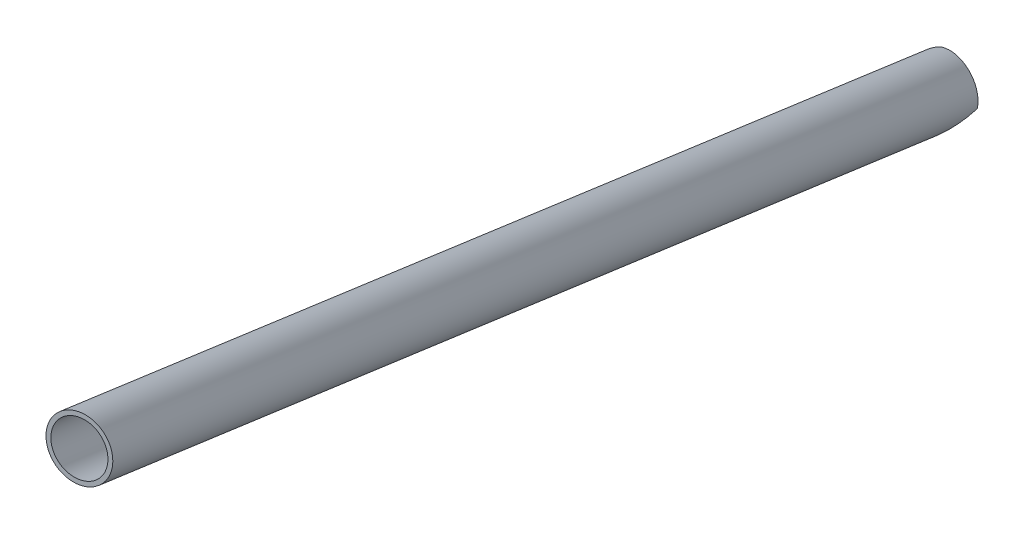
ISO-10303-21;
HEADER;
FILE_DESCRIPTION(('STEP AP214'),'2;1');
FILE_NAME('part.step','',(''),(''),'','','');
FILE_SCHEMA(('AUTOMOTIVE_DESIGN { 1 0 10303 214 1 1 1 1 }'));
ENDSEC;
DATA;
#1=APPLICATION_CONTEXT('core data for automotive mechanical design processes');
#2=APPLICATION_PROTOCOL_DEFINITION('international standard','automotive_design',2000,#1);
#3=PRODUCT_CONTEXT('',#1,'mechanical');
#4=PRODUCT('Part','Part','',(#3));
#5=PRODUCT_RELATED_PRODUCT_CATEGORY('part','',(#4));
#6=PRODUCT_DEFINITION_FORMATION('','',#4);
#7=PRODUCT_DEFINITION_CONTEXT('part definition',#1,'design');
#8=PRODUCT_DEFINITION('design','',#6,#7);
#9=PRODUCT_DEFINITION_SHAPE('','',#8);
#10=(LENGTH_UNIT() NAMED_UNIT(*) SI_UNIT(.MILLI.,.METRE.));
#11=(NAMED_UNIT(*) PLANE_ANGLE_UNIT() SI_UNIT($,.RADIAN.));
#12=(NAMED_UNIT(*) SI_UNIT($,.STERADIAN.) SOLID_ANGLE_UNIT());
#13=UNCERTAINTY_MEASURE_WITH_UNIT(LENGTH_MEASURE(1.E-05),#10,'distance_accuracy_value','');
#14=(GEOMETRIC_REPRESENTATION_CONTEXT(3) GLOBAL_UNCERTAINTY_ASSIGNED_CONTEXT((#13)) GLOBAL_UNIT_ASSIGNED_CONTEXT((#10,
#11,#12)) REPRESENTATION_CONTEXT('',''));
#15=CARTESIAN_POINT('',(0.,0.,0.));
#16=DIRECTION('',(0.,0.,1.));
#17=DIRECTION('',(1.,0.,0.));
#18=AXIS2_PLACEMENT_3D('',#15,#16,#17);
#19=CARTESIAN_POINT('',(-325.,300.,-1635.));
#20=DIRECTION('',(0.305086927914118,0.383537852234891,0.87167693689748));
#21=DIRECTION('',(0.,-0.915315032422766,0.402738614266017));
#22=AXIS2_PLACEMENT_3D('',#19,#20,#21);
#23=CYLINDRICAL_SURFACE('',#22,9.39999999999998);
#24=CARTESIAN_POINT('',(-150.,520.,-1135.));
#25=DIRECTION('',(0.115574148793694,-0.0210807288815672,0.993075132606005));
#26=DIRECTION('',(0.448247106224794,0.89329278301208,-0.0332044512020934));
#27=AXIS2_PLACEMENT_3D('',#24,#25,#26);
#28=ELLIPSE('',#27,10.528489937713,9.39999999999998);
#29=CARTESIAN_POINT('',(-145.280634852504,529.405024077374,-1135.34959273037));
#30=VERTEX_POINT('',#29);
#31=EDGE_CURVE('E109',#30,#30,#28,.T.);
#32=ORIENTED_EDGE('',*,*,#31,.T.);
#33=EDGE_LOOP('',(#32));
#34=FACE_BOUND('',#33,.T.);
#35=CARTESIAN_POINT('',(-314.296101449326,304.852368301788,-1600.63168973826));
#36=CARTESIAN_POINT('',(-314.370129416697,304.926966198328,-1600.46215439192));
#37=CARTESIAN_POINT('',(-314.448716894606,305.003174331295,-1600.29531301659));
#38=CARTESIAN_POINT('',(-314.616763771539,305.159229641493,-1599.96873008616));
#39=CARTESIAN_POINT('',(-314.706229631926,305.239078963689,-1599.80899282834));
#40=CARTESIAN_POINT('',(-314.897580075582,305.402303768852,-1599.50017505858));
#41=CARTESIAN_POINT('',(-314.999403888589,305.485660777551,-1599.35104769466));
#42=CARTESIAN_POINT('',(-315.218008365695,305.656297382618,-1599.0668231001));
#43=CARTESIAN_POINT('',(-315.334764442953,305.74357038108,-1598.9317034527));
#44=CARTESIAN_POINT('',(-315.570005487824,305.91072053572,-1598.69678304075));
#45=CARTESIAN_POINT('',(-315.686463757581,305.990164928453,-1598.5946793715));
#46=CARTESIAN_POINT('',(-315.933520378854,306.150998670485,-1598.41102448675));
#47=CARTESIAN_POINT('',(-316.064106375566,306.232386272653,-1598.32945551792));
#48=CARTESIAN_POINT('',(-316.340265701727,306.396242442613,-1598.19219129611));
#49=CARTESIAN_POINT('',(-316.48598916781,306.478712989346,-1598.13679298633));
#50=CARTESIAN_POINT('',(-316.787424715642,306.640774060314,-1598.05853530401));
#51=CARTESIAN_POINT('',(-316.943127296932,306.720367214225,-1598.03564544945));
#52=CARTESIAN_POINT('',(-317.241482345359,306.865283082171,-1598.02414047217));
#53=CARTESIAN_POINT('',(-317.383724902509,306.931218172462,-1598.03208610079));
#54=CARTESIAN_POINT('',(-317.667420323657,307.056990088295,-1598.07237281441));
#55=CARTESIAN_POINT('',(-317.808872404894,307.116821630033,-1598.10473483646));
#56=CARTESIAN_POINT('',(-318.150347378655,307.255140566953,-1598.20901648924));
#57=CARTESIAN_POINT('',(-318.348350390152,307.330044258999,-1598.29214234));
#58=CARTESIAN_POINT('',(-318.733017449835,307.467286566126,-1598.48923198467));
#59=CARTESIAN_POINT('',(-318.919648391871,307.529589615493,-1598.60328099646));
#60=CARTESIAN_POINT('',(-319.266166563359,307.638917812506,-1598.84258419092));
#61=CARTESIAN_POINT('',(-319.426990045357,307.68677914757,-1598.96613883763));
#62=CARTESIAN_POINT('',(-319.739649189969,307.775190700541,-1599.22664844794));
#63=CARTESIAN_POINT('',(-319.891476454943,307.815734157507,-1599.36361562494));
#64=CARTESIAN_POINT('',(-320.187295970461,307.890820249322,-1599.64779232493));
#65=CARTESIAN_POINT('',(-320.331272240109,307.925350936846,-1599.79502144395));
#66=CARTESIAN_POINT('',(-320.611976493674,307.989319660579,-1600.09711295385));
#67=CARTESIAN_POINT('',(-320.748707382038,308.018759748327,-1600.25197223725));
#68=CARTESIAN_POINT('',(-321.091748807924,308.088900080665,-1600.65743229555));
#69=CARTESIAN_POINT('',(-321.293464799175,308.126497208071,-1600.9124499979));
#70=CARTESIAN_POINT('',(-321.684095656583,308.193545552538,-1601.43321018049));
#71=CARTESIAN_POINT('',(-321.873003570701,308.222992372037,-1601.69895836217));
#72=CARTESIAN_POINT('',(-322.240261598498,308.275385814814,-1602.23897687833));
#73=CARTESIAN_POINT('',(-322.418590983399,308.298319989042,-1602.5132624369));
#74=CARTESIAN_POINT('',(-322.765842862426,308.338818349019,-1603.06812109157));
#75=CARTESIAN_POINT('',(-322.934764275454,308.356381918654,-1603.34869490511));
#76=CARTESIAN_POINT('',(-323.265654992665,308.387168823544,-1603.91710521909));
#77=CARTESIAN_POINT('',(-323.427558863219,308.400356789403,-1604.20498157521));
#78=CARTESIAN_POINT('',(-323.743924280286,308.422931856589,-1604.78494239969));
#79=CARTESIAN_POINT('',(-323.898385540036,308.432318811565,-1605.07702702965));
#80=CARTESIAN_POINT('',(-324.200367615695,308.447867333695,-1605.66427773993));
#81=CARTESIAN_POINT('',(-324.347898605968,308.454033772739,-1605.9594384728));
#82=CARTESIAN_POINT('',(-324.636851154068,308.463647321341,-1606.55277077011));
#83=CARTESIAN_POINT('',(-324.778272732884,308.467094440242,-1606.85094232421));
#84=CARTESIAN_POINT('',(-325.073927178763,308.471988792391,-1607.48977961142));
#85=CARTESIAN_POINT('',(-325.227359313934,308.473108709047,-1607.83081821973));
#86=CARTESIAN_POINT('',(-325.527510877359,308.472910409199,-1608.51584112024));
#87=CARTESIAN_POINT('',(-325.674230053473,308.471592101191,-1608.85982552252));
#88=CARTESIAN_POINT('',(-326.104999009524,308.464686001449,-1609.89580053325));
#89=CARTESIAN_POINT('',(-326.379612954597,308.456146539896,-1610.5917100176));
#90=CARTESIAN_POINT('',(-326.906565783877,308.434549351816,-1611.99444087289));
#91=CARTESIAN_POINT('',(-327.158827771472,308.421476734233,-1612.70129077889));
#92=CARTESIAN_POINT('',(-327.520078533297,308.401069549038,-1613.76724519635));
#93=CARTESIAN_POINT('',(-327.637628213306,308.394134797495,-1614.12347630873));
#94=CARTESIAN_POINT('',(-327.866931716941,308.380481881317,-1614.83780136213));
#95=CARTESIAN_POINT('',(-327.978685631878,308.37376371327,-1615.1958952737));
#96=CARTESIAN_POINT('',(-328.195008498824,308.361146836663,-1615.90992969318));
#97=CARTESIAN_POINT('',(-328.29964335325,308.355239871456,-1616.26585008336));
#98=CARTESIAN_POINT('',(-328.502748132645,308.34475450974,-1616.97945837339));
#99=CARTESIAN_POINT('',(-328.601218217413,308.340176078783,-1617.33714622716));
#100=CARTESIAN_POINT('',(-328.791589564073,308.333049003222,-1618.05457882359));
#101=CARTESIAN_POINT('',(-328.883485828305,308.33050188828,-1618.41432491126));
#102=CARTESIAN_POINT('',(-329.059926895106,308.32829811925,-1619.13562199897));
#103=CARTESIAN_POINT('',(-329.144471903608,308.328641384166,-1619.49717294816));
#104=CARTESIAN_POINT('',(-329.304826164805,308.333263615952,-1620.22036130513));
#105=CARTESIAN_POINT('',(-329.380675654272,308.337523557707,-1620.58198985375));
#106=CARTESIAN_POINT('',(-329.522720213157,308.351260437985,-1621.30711456741));
#107=CARTESIAN_POINT('',(-329.588913986505,308.360738076058,-1621.67061097639));
#108=CARTESIAN_POINT('',(-329.709557174618,308.386550403732,-1622.39882644642));
#109=CARTESIAN_POINT('',(-329.764022291573,308.402875838116,-1622.76354320051));
#110=CARTESIAN_POINT('',(-329.858477039252,308.44446992143,-1623.49429905203));
#111=CARTESIAN_POINT('',(-329.89847226525,308.469735106012,-1623.86033758293));
#112=CARTESIAN_POINT('',(-329.939494618189,308.51120335834,-1624.34973900026));
#113=CARTESIAN_POINT('',(-329.948763446862,308.522285424804,-1624.47286424523));
#114=CARTESIAN_POINT('',(-329.964994442171,308.545869565735,-1624.71913576656));
#115=CARTESIAN_POINT('',(-329.971956510332,308.558371700793,-1624.84228204359));
#116=CARTESIAN_POINT('',(-329.989066180693,308.598186618809,-1625.21171955466));
#117=CARTESIAN_POINT('',(-329.995433171061,308.627804042989,-1625.45796270029));
#118=CARTESIAN_POINT('',(-329.996015370802,308.694094460451,-1625.94923256314));
#119=CARTESIAN_POINT('',(-329.990245818134,308.730758553813,-1626.19426041901));
#120=CARTESIAN_POINT('',(-329.964084541531,308.812063566514,-1626.68224091677));
#121=CARTESIAN_POINT('',(-329.943695436423,308.856703056131,-1626.92519392244));
#122=CARTESIAN_POINT('',(-329.890350666237,308.94635099593,-1627.3667916472));
#123=CARTESIAN_POINT('',(-329.860081145861,308.990037951073,-1627.56602401276));
#124=CARTESIAN_POINT('',(-329.785769230988,309.083409950268,-1627.96050283728));
#125=CARTESIAN_POINT('',(-329.741728348523,309.133094335462,-1628.15574973132));
#126=CARTESIAN_POINT('',(-329.638411224959,309.238024358037,-1628.54041309836));
#127=CARTESIAN_POINT('',(-329.579153440393,309.293263209384,-1628.72983632537));
#128=CARTESIAN_POINT('',(-329.444276123139,309.408417966414,-1629.10132015932));
#129=CARTESIAN_POINT('',(-329.368657234359,309.468333687975,-1629.28338105568));
#130=CARTESIAN_POINT('',(-329.200045638106,309.591743121596,-1629.63964550875));
#131=CARTESIAN_POINT('',(-329.106940871305,309.655257955153,-1629.81378884618));
#132=CARTESIAN_POINT('',(-328.904006010556,309.783491485278,-1630.15157547485));
#133=CARTESIAN_POINT('',(-328.794175188113,309.848210234175,-1630.31521830831));
#134=CARTESIAN_POINT('',(-328.558686132079,309.976677509535,-1630.63138020417));
#135=CARTESIAN_POINT('',(-328.43301063722,310.040424891586,-1630.78388684418));
#136=CARTESIAN_POINT('',(-328.167433734069,310.164657613079,-1631.07737952559));
#137=CARTESIAN_POINT('',(-328.027532074596,310.225142894896,-1631.21836536349));
#138=CARTESIAN_POINT('',(-327.74773311068,310.335909515875,-1631.47752360104));
#139=CARTESIAN_POINT('',(-327.608853307755,310.3866211553,-1631.59661616466));
#140=CARTESIAN_POINT('',(-327.322035508422,310.482331405722,-1631.825801556));
#141=CARTESIAN_POINT('',(-327.174098320161,310.527330525323,-1631.93589518463));
#142=CARTESIAN_POINT('',(-326.870466310968,310.610537014195,-1632.14761946716));
#143=CARTESIAN_POINT('',(-326.714771095088,310.64874403724,-1632.2492496895));
#144=CARTESIAN_POINT('',(-326.396849651947,310.71749104798,-1632.44459586847));
#145=CARTESIAN_POINT('',(-326.234622590198,310.748030052405,-1632.53831080909));
#146=CARTESIAN_POINT('',(-325.873107207144,310.805796109412,-1632.73562840134));
#147=CARTESIAN_POINT('',(-325.67268424098,310.83126101343,-1632.83767398072));
#148=CARTESIAN_POINT('',(-325.265977318575,310.869380719111,-1633.03201415123));
#149=CARTESIAN_POINT('',(-325.059692831587,310.882034356922,-1633.12430785576));
#150=CARTESIAN_POINT('',(-324.642805040182,310.893877639016,-1633.2998146142));
#151=CARTESIAN_POINT('',(-324.43219974053,310.893060916616,-1633.38302335545));
#152=CARTESIAN_POINT('',(-324.008286909548,310.877498259782,-1633.5408053565));
#153=CARTESIAN_POINT('',(-323.794979259059,310.862751708986,-1633.61537823402));
#154=CARTESIAN_POINT('',(-323.339154567764,310.816196253583,-1633.76545507889));
#155=CARTESIAN_POINT('',(-323.096458213544,310.782411934432,-1633.83981067818));
#156=CARTESIAN_POINT('',(-322.611385092292,310.696517904077,-1633.97831971119));
#157=CARTESIAN_POINT('',(-322.369008353701,310.64440665976,-1634.04247229073));
#158=CARTESIAN_POINT('',(-321.886382300832,310.521913228698,-1634.16078867966));
#159=CARTESIAN_POINT('',(-321.646133461562,310.451527063736,-1634.21495030973));
#160=CARTESIAN_POINT('',(-321.169580709717,310.292768472091,-1634.3133403367));
#161=CARTESIAN_POINT('',(-320.933276785937,310.204396096502,-1634.35756876181));
#162=CARTESIAN_POINT('',(-320.459110924192,310.007159045777,-1634.43725855469));
#163=CARTESIAN_POINT('',(-320.22142335882,309.897749141515,-1634.4724095418));
#164=CARTESIAN_POINT('',(-319.753718178809,309.661058024214,-1634.53196428675));
#165=CARTESIAN_POINT('',(-319.52370077386,309.533776323087,-1634.556367751));
#166=CARTESIAN_POINT('',(-319.072947189433,309.262291021702,-1634.5941610686));
#167=CARTESIAN_POINT('',(-318.852210604415,309.118088161888,-1634.60755140367));
#168=CARTESIAN_POINT('',(-318.421475744143,308.813903051321,-1634.62294390502));
#169=CARTESIAN_POINT('',(-318.211477405179,308.653920894205,-1634.62494613889));
#170=CARTESIAN_POINT('',(-317.803207545492,308.319255050538,-1634.61705730068));
#171=CARTESIAN_POINT('',(-317.604955561798,308.144547980556,-1634.60714696726));
#172=CARTESIAN_POINT('',(-317.221712884351,307.782222760827,-1634.57475595207));
#173=CARTESIAN_POINT('',(-317.036722359459,307.594604446738,-1634.55227511026));
#174=CARTESIAN_POINT('',(-316.680879511149,307.208130507258,-1634.49390759372));
#175=CARTESIAN_POINT('',(-316.510036581871,307.009267560458,-1634.45801209735));
#176=CARTESIAN_POINT('',(-316.183427914878,306.602489364184,-1634.37179340927));
#177=CARTESIAN_POINT('',(-316.027661854777,306.394574308405,-1634.32147052614));
#178=CARTESIAN_POINT('',(-315.732822814694,305.973563161773,-1634.20553978087));
#179=CARTESIAN_POINT('',(-315.593640633404,305.760513516124,-1634.14004135988));
#180=CARTESIAN_POINT('',(-315.331029497723,305.330569768817,-1633.99206742462));
#181=CARTESIAN_POINT('',(-315.20760213182,305.113675282008,-1633.90959020064));
#182=CARTESIAN_POINT('',(-314.976738145145,304.679667965822,-1633.7260834921));
#183=CARTESIAN_POINT('',(-314.869277731474,304.46255595668,-1633.6250821232));
#184=CARTESIAN_POINT('',(-314.669853960134,304.031736538476,-1633.40263594779));
#185=CARTESIAN_POINT('',(-314.577884308066,303.818027778682,-1633.28119948501));
#186=CARTESIAN_POINT('',(-314.431324155086,303.454748759235,-1633.05174881841));
#187=CARTESIAN_POINT('',(-314.373316625071,303.30331742707,-1632.94883757815));
#188=CARTESIAN_POINT('',(-314.264727860444,303.006743489184,-1632.73078770343));
#189=CARTESIAN_POINT('',(-314.214144761849,302.861599311478,-1632.61565215055));
#190=CARTESIAN_POINT('',(-314.119851919051,302.57983974557,-1632.37325086798));
#191=CARTESIAN_POINT('',(-314.076131441089,302.443211244056,-1632.24600459165));
#192=CARTESIAN_POINT('',(-313.994702183547,302.18013679741,-1631.97960130254));
#193=CARTESIAN_POINT('',(-313.956993460771,302.053690948494,-1631.84044417724));
#194=CARTESIAN_POINT('',(-313.886686822253,301.812438232875,-1631.55097776094));
#195=CARTESIAN_POINT('',(-313.854093246931,301.697641279632,-1631.40065915656));
#196=CARTESIAN_POINT('',(-313.793135766648,301.480811769867,-1631.09029742556));
#197=CARTESIAN_POINT('',(-313.764771825738,301.378779104859,-1630.93025438159));
#198=CARTESIAN_POINT('',(-313.711363342865,301.187751071636,-1630.60190696197));
#199=CARTESIAN_POINT('',(-313.686321264822,301.098765375637,-1630.43359657959));
#200=CARTESIAN_POINT('',(-313.638786687259,300.933621815414,-1630.09042571711));
#201=CARTESIAN_POINT('',(-313.616295076556,300.857468418676,-1629.91556298163));
#202=CARTESIAN_POINT('',(-313.561182208027,300.678199734968,-1629.46193447795));
#203=CARTESIAN_POINT('',(-313.529903136798,300.583718004405,-1629.17958469193));
#204=CARTESIAN_POINT('',(-313.470136244672,300.420133560451,-1628.60735146448));
#205=CARTESIAN_POINT('',(-313.441650415902,300.351048864944,-1628.31746283014));
#206=CARTESIAN_POINT('',(-313.386348993816,300.233723556,-1627.73227655562));
#207=CARTESIAN_POINT('',(-313.359540089529,300.185562363554,-1627.43696266525));
#208=CARTESIAN_POINT('',(-313.320271195898,300.126330441694,-1626.99231479125));
#209=CARTESIAN_POINT('',(-313.307340417466,300.108756060699,-1626.84383661272));
#210=CARTESIAN_POINT('',(-313.281757362175,300.07752138756,-1626.54644182291));
#211=CARTESIAN_POINT('',(-313.269105086301,300.063861109263,-1626.39752521007));
#212=CARTESIAN_POINT('',(-313.235088809794,300.031553014937,-1625.99270348001));
#213=CARTESIAN_POINT('',(-313.213970437059,300.016332431198,-1625.73650322135));
#214=CARTESIAN_POINT('',(-313.172430619768,299.994626998854,-1625.22366125156));
#215=CARTESIAN_POINT('',(-313.152009283305,299.988143499223,-1624.96701947837));
#216=CARTESIAN_POINT('',(-313.111869720948,299.982588553638,-1624.45347100399));
#217=CARTESIAN_POINT('',(-313.092151877842,299.983521082967,-1624.19656423453));
#218=CARTESIAN_POINT('',(-313.053478390468,299.991744779528,-1623.68278935629));
#219=CARTESIAN_POINT('',(-313.034522795017,299.999036353339,-1623.42592125102));
#220=CARTESIAN_POINT('',(-312.978812883198,300.029158000152,-1622.65435187856));
#221=CARTESIAN_POINT('',(-312.94330910129,300.060239271315,-1622.13987758342));
#222=CARTESIAN_POINT('',(-312.876310163546,300.139237721737,-1621.11217683819));
#223=CARTESIAN_POINT('',(-312.844813883701,300.187150166012,-1620.59895007799));
#224=CARTESIAN_POINT('',(-312.786299049728,300.296967269404,-1619.56930103324));
#225=CARTESIAN_POINT('',(-312.759321082475,300.35898805908,-1619.05288894497));
#226=CARTESIAN_POINT('',(-312.710955286673,300.494486691986,-1618.02128698943));
#227=CARTESIAN_POINT('',(-312.689567815535,300.567965267255,-1617.50609720238));
#228=CARTESIAN_POINT('',(-312.653247631506,300.724704148675,-1616.47788896932));
#229=CARTESIAN_POINT('',(-312.638303907058,300.807947455887,-1615.96486831446));
#230=CARTESIAN_POINT('',(-312.615722837388,300.983308020109,-1614.94019915889));
#231=CARTESIAN_POINT('',(-312.608085291689,301.075425033554,-1614.42855062093));
#232=CARTESIAN_POINT('',(-312.601155598859,301.267545753763,-1613.40873872166));
#233=CARTESIAN_POINT('',(-312.601831077616,301.367517360283,-1612.90056954689));
#234=CARTESIAN_POINT('',(-312.612642478699,301.575362570887,-1611.88592566735));
#235=CARTESIAN_POINT('',(-312.622778708828,301.683236431965,-1611.37945101824));
#236=CARTESIAN_POINT('',(-312.65399682893,301.907075419772,-1610.36757684706));
#237=CARTESIAN_POINT('',(-312.67510014059,302.02305599599,-1609.8621813799));
#238=CARTESIAN_POINT('',(-312.730106742973,302.263153358597,-1608.85404764739));
#239=CARTESIAN_POINT('',(-312.764008952531,302.387269457021,-1608.35130916122));
#240=CARTESIAN_POINT('',(-312.846494423355,302.642519012423,-1607.35581807987));
#241=CARTESIAN_POINT('',(-312.894880902204,302.773540136927,-1606.86302067049));
#242=CARTESIAN_POINT('',(-313.009646322879,303.044983430928,-1605.88184647513));
#243=CARTESIAN_POINT('',(-313.07603168019,303.185408939041,-1605.39347132968));
#244=CARTESIAN_POINT('',(-313.1923912465,303.403880038872,-1604.6667470659));
#245=CARTESIAN_POINT('',(-313.233902918193,303.477897048454,-1604.42582138637));
#246=CARTESIAN_POINT('',(-313.323301139612,303.62884111459,-1603.94608109909));
#247=CARTESIAN_POINT('',(-313.371187175204,303.70576793609,-1603.70726632275));
#248=CARTESIAN_POINT('',(-313.474226258528,303.862767344709,-1603.23243864267));
#249=CARTESIAN_POINT('',(-313.529374123251,303.942837659871,-1602.99642387023));
#250=CARTESIAN_POINT('',(-313.648128739946,304.106522656852,-1602.52779699204));
#251=CARTESIAN_POINT('',(-313.711733815025,304.190136633801,-1602.29518422185));
#252=CARTESIAN_POINT('',(-313.816753661474,304.321211171419,-1601.94245413961));
#253=CARTESIAN_POINT('',(-313.854587494575,304.367238629068,-1601.82073529824));
#254=CARTESIAN_POINT('',(-313.933358155932,304.460503934801,-1601.57876694004));
#255=CARTESIAN_POINT('',(-313.974295237471,304.507741881475,-1601.45851754407));
#256=CARTESIAN_POINT('',(-314.102573111728,304.651793817424,-1601.09935519878));
#257=CARTESIAN_POINT('',(-314.195092915656,304.75058212,-1600.86301470025));
#258=CARTESIAN_POINT('',(-314.296101449326,304.852368301788,-1600.63168973826));
#259=B_SPLINE_CURVE_WITH_KNOTS('',3,(#35,#36,#37,#38,#39,#40,#41,#42,#43,#44,#45,#46,#47,#48,
#49,#50,#51,#52,#53,#54,#55,#56,#57,#58,#59,#60,#61,#62,#63,#64,#65,#66,#67,#68,#69,#70,#71,#72,
#73,#74,#75,#76,#77,#78,#79,#80,#81,#82,#83,#84,#85,#86,#87,#88,#89,#90,#91,#92,#93,#94,#95,#96,
#97,#98,#99,#100,#101,#102,#103,#104,#105,#106,#107,#108,#109,#110,#111,#112,#113,#114,#115,
#116,#117,#118,#119,#120,#121,#122,#123,#124,#125,#126,#127,#128,#129,#130,#131,#132,#133,#134,
#135,#136,#137,#138,#139,#140,#141,#142,#143,#144,#145,#146,#147,#148,#149,#150,#151,#152,#153,
#154,#155,#156,#157,#158,#159,#160,#161,#162,#163,#164,#165,#166,#167,#168,#169,#170,#171,#172,
#173,#174,#175,#176,#177,#178,#179,#180,#181,#182,#183,#184,#185,#186,#187,#188,#189,#190,#191,
#192,#193,#194,#195,#196,#197,#198,#199,#200,#201,#202,#203,#204,#205,#206,#207,#208,#209,#210,
#211,#212,#213,#214,#215,#216,#217,#218,#219,#220,#221,#222,#223,#224,#225,#226,#227,#228,#229,
#230,#231,#232,#233,#234,#235,#236,#237,#238,#239,#240,#241,#242,#243,#244,#245,#246,#247,#248,
#249,#250,#251,#252,#253,#254,#255,#256,#257,#258),.UNSPECIFIED.,.T.,.F.,(4,2,2,2,2,2,2,2,2,2,2,
2,2,2,2,2,2,2,2,2,2,2,2,2,2,2,2,2,2,2,2,2,2,2,2,2,2,2,2,2,2,2,2,2,2,2,2,2,2,2,2,2,2,2,2,2,2,2,2,
2,2,2,2,2,2,2,2,2,2,2,2,2,2,2,2,2,2,2,2,2,2,2,2,2,2,2,2,2,2,2,2,2,2,2,2,2,2,2,2,2,2,2,2,2,2,2,2,
2,2,2,2,4),(0.,0.598297510528112,1.19695214000898,1.79277386536911,2.38762687068088,
2.90838780156386,3.428696949057,3.95477579299483,4.48036102506002,4.94910124208257,
5.41824386095955,6.09666142092366,6.776967903739,7.40117486284076,8.02595560325424,
8.65196395291082,9.27771942689022,10.2589267839793,11.240662531685,12.2242624453861,
13.2079751550877,14.1994560849502,15.1909751859439,16.1809899728677,17.1710013581862,
18.2928049745569,19.4146506916848,21.6586816749961,23.9101550658238,25.0356810141376,
26.1611892247756,27.2742237799031,28.3872294718118,29.5010725118377,30.6148843393103,
31.723314287655,32.8318928820479,33.9389779678901,35.0456345031546,35.4175195409284,
35.7894204523728,36.5333634603737,37.2763729730512,38.0192494222716,38.6373417376818,
39.2553662131945,39.8726446004686,40.4898986985461,41.1112525394814,41.7326334509269,
42.3546972439945,42.9767720223359,43.5457854921783,44.1147482654383,44.6837400332851,
45.2528047258062,45.9311473938583,46.6095516810527,47.288276621079,47.9670315944508,
48.7343597162346,49.5017520430606,50.2693115616953,51.0368688999442,51.8279599739304,
52.6190726572393,53.4101507355768,54.201224119775,54.9935783072594,55.785942582196,
56.5788288449161,57.3716981498191,58.1590183375193,58.9464178446014,59.7326319931619,
60.5185259027698,61.0941340468156,61.6695974302887,62.2441515700801,62.8187111382722,
63.3937556389558,63.9687952519684,64.5442590314095,65.1199227428951,66.0164778286883,
66.913667752086,67.8142340723954,68.2644130130027,68.7145935462086,69.4869576747174,
70.2594410397133,71.0323385139519,71.8052854085966,73.3547630029824,74.9038050434004,
76.4660913509588,78.0284775139927,79.5881830707506,81.1478458290147,82.7014365895013,
84.2550778977497,85.8117653593144,87.3683213518591,88.9046221859932,90.4414713376971,
91.2076929110845,91.9738527211513,92.7394686318297,93.504932962031,93.9114444777587,
94.3179892083873,95.1343449234266),.UNSPECIFIED.);
#260=CARTESIAN_POINT('',(-312.738230078514,300.418148849274,-1618.60271789503));
#261=VERTEX_POINT('',#260);
#262=CARTESIAN_POINT('',(-327.002978450571,310.574199761038,-1632.0551806823));
#263=VERTEX_POINT('',#262);
#264=EDGE_CURVE('E116',#261,#263,#259,.T.);
#265=ORIENTED_EDGE('',*,*,#264,.T.);
#266=CARTESIAN_POINT('',(-317.462633704414,300.871584895392,-1609.67892475279));
#267=CARTESIAN_POINT('',(-317.58163330168,300.885286429933,-1609.64778726876));
#268=CARTESIAN_POINT('',(-317.702134770599,300.899162129969,-1609.62233101353));
#269=CARTESIAN_POINT('',(-317.945014909773,300.927134679895,-1609.58280138467));
#270=CARTESIAN_POINT('',(-318.067394734043,300.941231665871,-1609.56873531954));
#271=CARTESIAN_POINT('',(-318.313182444603,300.969554329373,-1609.55163994574));
#272=CARTESIAN_POINT('',(-318.436592040527,300.983780227285,-1609.54863591733));
#273=CARTESIAN_POINT('',(-318.683265757315,301.012232980996,-1609.55311408914));
#274=CARTESIAN_POINT('',(-318.806529752058,301.026459832552,-1609.56060238071));
#275=CARTESIAN_POINT('',(-319.085620629177,301.058702229334,-1609.588651653));
#276=CARTESIAN_POINT('',(-319.241148841837,301.076691592126,-1609.61222379559));
#277=CARTESIAN_POINT('',(-319.5495403667,301.112425984719,-1609.67328380524));
#278=CARTESIAN_POINT('',(-319.702401466481,301.130170809323,-1609.7107826991));
#279=CARTESIAN_POINT('',(-320.004825158018,301.165363509657,-1609.79792715097));
#280=CARTESIAN_POINT('',(-320.154383488495,301.18281099581,-1609.84758750356));
#281=CARTESIAN_POINT('',(-320.44957426474,301.217356331517,-1609.95734666905));
#282=CARTESIAN_POINT('',(-320.595207604714,301.234454260491,-1610.01744308074));
#283=CARTESIAN_POINT('',(-320.983177656646,301.280180085382,-1610.19191062302));
#284=CARTESIAN_POINT('',(-321.221734940303,301.308488071428,-1610.31479574455));
#285=CARTESIAN_POINT('',(-321.687418570632,301.364229927849,-1610.58078402285));
#286=CARTESIAN_POINT('',(-321.914536049039,301.391663114203,-1610.72390254732));
#287=CARTESIAN_POINT('',(-322.358318838906,301.4458575658,-1611.02633024236));
#288=CARTESIAN_POINT('',(-322.574965027837,301.472617561901,-1611.18566749749));
#289=CARTESIAN_POINT('',(-322.998160809163,301.525593334738,-1611.51711953175));
#290=CARTESIAN_POINT('',(-323.204712777366,301.551809238689,-1611.68923127996));
#291=CARTESIAN_POINT('',(-323.621031922632,301.605493529007,-1612.05482340104));
#292=CARTESIAN_POINT('',(-323.830217053441,301.632939916729,-1612.24896696092));
#293=CARTESIAN_POINT('',(-324.239176841008,301.687670669582,-1612.6469923761));
#294=CARTESIAN_POINT('',(-324.438949339971,301.714954996321,-1612.85087644299));
#295=CARTESIAN_POINT('',(-324.82999514005,301.769604073591,-1613.2669453656));
#296=CARTESIAN_POINT('',(-325.021260756442,301.796968873951,-1613.47913741363));
#297=CARTESIAN_POINT('',(-325.395794652823,301.851987484056,-1613.91045499487));
#298=CARTESIAN_POINT('',(-325.579061983549,301.879641327625,-1614.12958134578));
#299=CARTESIAN_POINT('',(-325.938958189278,301.935603590672,-1614.57480580979));
#300=CARTESIAN_POINT('',(-326.115552757723,301.963914430832,-1614.80093129177));
#301=CARTESIAN_POINT('',(-326.461682921595,302.021331400869,-1615.25842549912));
#302=CARTESIAN_POINT('',(-326.631218286515,302.050437556664,-1615.48979439533));
#303=CARTESIAN_POINT('',(-326.963486170877,302.109715256937,-1615.95698648343));
#304=CARTESIAN_POINT('',(-327.126223255078,302.139886060596,-1616.19280652692));
#305=CARTESIAN_POINT('',(-327.445303078623,302.201641359603,-1616.66853903609));
#306=CARTESIAN_POINT('',(-327.601645949029,302.233225825947,-1616.90845141774));
#307=CARTESIAN_POINT('',(-327.935159728628,302.303914282443,-1617.43455104293));
#308=CARTESIAN_POINT('',(-328.111146468109,302.34336260842,-1617.72144329008));
#309=CARTESIAN_POINT('',(-328.45477432697,302.425490762958,-1618.29973882729));
#310=CARTESIAN_POINT('',(-328.622415151783,302.468170705444,-1618.5911422761));
#311=CARTESIAN_POINT('',(-328.949583881731,302.557754626103,-1619.17834771497));
#312=CARTESIAN_POINT('',(-329.109100739816,302.604664127691,-1619.47415502283));
#313=CARTESIAN_POINT('',(-329.419585949253,302.703851986278,-1620.06932411173));
#314=CARTESIAN_POINT('',(-329.570554739908,302.756130066984,-1620.36868570915));
#315=CARTESIAN_POINT('',(-329.862577399316,302.867266553885,-1620.96866336124));
#316=CARTESIAN_POINT('',(-330.00368688531,302.92608219925,-1621.26926016293));
#317=CARTESIAN_POINT('',(-330.276197479758,303.052581255841,-1621.87309712521));
#318=CARTESIAN_POINT('',(-330.407596428451,303.120266630595,-1622.1763378572));
#319=CARTESIAN_POINT('',(-330.658949470172,303.267012178521,-1622.78403074557));
#320=CARTESIAN_POINT('',(-330.778928058698,303.346047050253,-1623.08847878019));
#321=CARTESIAN_POINT('',(-331.005435992491,303.519095282574,-1623.69804601797));
#322=CARTESIAN_POINT('',(-331.111973540045,303.613099428268,-1624.00316469506));
#323=CARTESIAN_POINT('',(-331.272066792664,303.782653449059,-1624.50072904897));
#324=CARTESIAN_POINT('',(-331.330737005347,303.852354090743,-1624.69351621639));
#325=CARTESIAN_POINT('',(-331.439876482691,304.000997015832,-1625.07793004976));
#326=CARTESIAN_POINT('',(-331.490344668692,304.079940512433,-1625.26955655988));
#327=CARTESIAN_POINT('',(-331.581256285608,304.248238121097,-1625.65006612823));
#328=CARTESIAN_POINT('',(-331.621724177474,304.337566028797,-1625.8389547951));
#329=CARTESIAN_POINT('',(-331.69071436154,304.528009759654,-1626.21296073793));
#330=CARTESIAN_POINT('',(-331.7192403153,304.629121957414,-1626.39807915331));
#331=CARTESIAN_POINT('',(-331.757600044614,304.821614289929,-1626.72491671219));
#332=CARTESIAN_POINT('',(-331.770080684213,304.910676910439,-1626.86768788873));
#333=CARTESIAN_POINT('',(-331.784918540321,305.096601021198,-1627.14858756283));
#334=CARTESIAN_POINT('',(-331.787278589338,305.193460321614,-1627.28671734868));
#335=CARTESIAN_POINT('',(-331.780884641126,305.394424010463,-1627.55722610639));
#336=CARTESIAN_POINT('',(-331.772137388715,305.498523965798,-1627.68960851783));
#337=CARTESIAN_POINT('',(-331.742844473144,305.713012133807,-1627.94782448513));
#338=CARTESIAN_POINT('',(-331.722298573897,305.823400472271,-1628.07365790989));
#339=CARTESIAN_POINT('',(-331.669118631715,306.049001658985,-1628.31815677877));
#340=CARTESIAN_POINT('',(-331.636488579144,306.164212903515,-1628.43682457405));
#341=CARTESIAN_POINT('',(-331.559244634358,306.397838498506,-1628.66685992359));
#342=CARTESIAN_POINT('',(-331.514630544899,306.516252901658,-1628.77822735766));
#343=CARTESIAN_POINT('',(-331.413764346754,306.754787970494,-1628.99403763754));
#344=CARTESIAN_POINT('',(-331.357493241736,306.874911119397,-1629.09846880847));
#345=CARTESIAN_POINT('',(-331.233989009421,307.115112247871,-1629.30071156678));
#346=CARTESIAN_POINT('',(-331.16675299783,307.235190207203,-1629.39852140282));
#347=CARTESIAN_POINT('',(-330.996558089713,307.51594668849,-1629.62157462057));
#348=CARTESIAN_POINT('',(-330.889358478075,307.676027392595,-1629.74434513772));
#349=CARTESIAN_POINT('',(-330.658110710385,307.990692732178,-1629.98072896363));
#350=CARTESIAN_POINT('',(-330.534056843493,308.145275482248,-1630.09433914764));
#351=CARTESIAN_POINT('',(-330.270737786779,308.446850081167,-1630.31416266886));
#352=CARTESIAN_POINT('',(-330.131457907349,308.593834394327,-1630.42036869809));
#353=CARTESIAN_POINT('',(-329.839383581438,308.878280396641,-1630.62668538926));
#354=CARTESIAN_POINT('',(-329.686590287793,309.015742896324,-1630.72679656993));
#355=CARTESIAN_POINT('',(-329.3653120554,309.282728130791,-1630.92429842217));
#356=CARTESIAN_POINT('',(-329.196550401748,309.412001016012,-1631.02157637478));
#357=CARTESIAN_POINT('',(-328.847785921375,309.657853167027,-1631.21191727136));
#358=CARTESIAN_POINT('',(-328.667782998237,309.774432323922,-1631.30498017916));
#359=CARTESIAN_POINT('',(-328.297923843263,309.993786777149,-1631.48754524663));
#360=CARTESIAN_POINT('',(-328.108070684199,310.096566342782,-1631.57704850152));
#361=CARTESIAN_POINT('',(-327.719752831921,310.287440222171,-1631.75298687879));
#362=CARTESIAN_POINT('',(-327.521287817672,310.375533987875,-1631.83942188657));
#363=CARTESIAN_POINT('',(-327.08980834393,310.54705753495,-1632.02095632265));
#364=CARTESIAN_POINT('',(-326.855738119838,310.628265086773,-1632.11565682343));
#365=CARTESIAN_POINT('',(-326.380028881357,310.769786613215,-1632.30165007528));
#366=CARTESIAN_POINT('',(-326.138389220058,310.830098796702,-1632.39294253361));
#367=CARTESIAN_POINT('',(-325.649392406903,310.929089349567,-1632.57210441563));
#368=CARTESIAN_POINT('',(-325.402033740853,310.967761919609,-1632.65997291584));
#369=CARTESIAN_POINT('',(-324.90360431381,311.022921733345,-1632.83205413589));
#370=CARTESIAN_POINT('',(-324.652533674843,311.039409704686,-1632.91626697554));
#371=CARTESIAN_POINT('',(-324.151314065213,311.049860561545,-1633.07981578187));
#372=CARTESIAN_POINT('',(-323.901183944296,311.04406241093,-1633.15919426643));
#373=CARTESIAN_POINT('',(-323.401057856086,311.01043588727,-1633.31359267888));
#374=CARTESIAN_POINT('',(-323.151061888687,310.982607531853,-1633.38861261027));
#375=CARTESIAN_POINT('',(-322.653077987496,310.905127248975,-1633.53373796224));
#376=CARTESIAN_POINT('',(-322.405089743514,310.855478760854,-1633.60384415531));
#377=CARTESIAN_POINT('',(-321.912845711908,310.734796145708,-1633.73852293159));
#378=CARTESIAN_POINT('',(-321.668589895029,310.663762186399,-1633.8030955582));
#379=CARTESIAN_POINT('',(-321.188717951248,310.502066700768,-1633.92516481409));
#380=CARTESIAN_POINT('',(-320.953029876433,310.411681295688,-1633.98274475568));
#381=CARTESIAN_POINT('',(-320.488382868679,310.211583834474,-1634.09104431738));
#382=CARTESIAN_POINT('',(-320.259423890718,310.10187190768,-1634.14176398339));
#383=CARTESIAN_POINT('',(-319.8095112313,309.864117719764,-1634.23547810146));
#384=CARTESIAN_POINT('',(-319.58855962543,309.73607074801,-1634.27847056184));
#385=CARTESIAN_POINT('',(-319.155900679796,309.462870206774,-1634.35570888302));
#386=CARTESIAN_POINT('',(-318.944193376586,309.317716569658,-1634.38995470924));
#387=CARTESIAN_POINT('',(-318.527343933663,309.008942753048,-1634.44905031711));
#388=CARTESIAN_POINT('',(-318.32238613173,308.845039482129,-1634.47372169732));
#389=CARTESIAN_POINT('',(-317.923947612216,308.502550901126,-1634.51131739895));
#390=CARTESIAN_POINT('',(-317.730467906416,308.323964300022,-1634.52424068623));
#391=CARTESIAN_POINT('',(-317.355676381009,307.953981677466,-1634.5365449416));
#392=CARTESIAN_POINT('',(-317.174365392786,307.762584782576,-1634.53592498536));
#393=CARTESIAN_POINT('',(-316.824445983748,307.369197213131,-1634.51893631376));
#394=CARTESIAN_POINT('',(-316.655834566467,307.167209056785,-1634.50257132608));
#395=CARTESIAN_POINT('',(-316.367371358178,306.800738274578,-1634.4570371437));
#396=CARTESIAN_POINT('',(-316.244966250893,306.637806901693,-1634.43148714357));
#397=CARTESIAN_POINT('',(-316.008125932664,306.308683371423,-1634.36767184299));
#398=CARTESIAN_POINT('',(-315.893689077172,306.142491896013,-1634.32940917576));
#399=CARTESIAN_POINT('',(-315.672974599289,305.808999118943,-1634.23859613512));
#400=CARTESIAN_POINT('',(-315.566683296313,305.641700214652,-1634.1860704224));
#401=CARTESIAN_POINT('',(-315.362017648688,305.308030559291,-1634.06502801979));
#402=CARTESIAN_POINT('',(-315.263641489402,305.141659603666,-1633.9965150093));
#403=CARTESIAN_POINT('',(-315.09215926327,304.84299468723,-1633.85633214943));
#404=CARTESIAN_POINT('',(-315.01774167648,304.710081935577,-1633.78758224911));
#405=CARTESIAN_POINT('',(-314.874018902507,304.448366547843,-1633.638005539));
#406=CARTESIAN_POINT('',(-314.804712504542,304.319562942483,-1633.55718160322));
#407=CARTESIAN_POINT('',(-314.671141133235,304.067849275899,-1633.38343592451));
#408=CARTESIAN_POINT('',(-314.606870910059,303.94493313085,-1633.29052705544));
#409=CARTESIAN_POINT('',(-314.483106046485,303.706360644693,-1633.09294380945));
#410=CARTESIAN_POINT('',(-314.423611464571,303.590704392495,-1632.98826928848));
#411=CARTESIAN_POINT('',(-314.309238123697,303.367983020346,-1632.76821950643));
#412=CARTESIAN_POINT('',(-314.254352613058,303.260905344882,-1632.65286043718));
#413=CARTESIAN_POINT('',(-314.148793455154,303.055818407743,-1632.41257902046));
#414=CARTESIAN_POINT('',(-314.098119885981,302.957809314201,-1632.28765649577));
#415=CARTESIAN_POINT('',(-314.000598872653,302.770939438635,-1632.02959096245));
#416=CARTESIAN_POINT('',(-313.953754719826,302.682086509463,-1631.89644105155));
#417=CARTESIAN_POINT('',(-313.863575249444,302.513324359511,-1631.62342863763));
#418=CARTESIAN_POINT('',(-313.82024119882,302.433418364083,-1631.48356373968));
#419=CARTESIAN_POINT('',(-313.705595043237,302.225522729396,-1631.09210530235));
#420=CARTESIAN_POINT('',(-313.637522793108,302.106122716984,-1630.83498706664));
#421=CARTESIAN_POINT('',(-313.509490418406,301.888874618203,-1630.30984976153));
#422=CARTESIAN_POINT('',(-313.449537448426,301.791045492728,-1630.0418213452));
#423=CARTESIAN_POINT('',(-313.336379504722,301.612433359685,-1629.49721026583));
#424=CARTESIAN_POINT('',(-313.283211905079,301.5317432624,-1629.22058985177));
#425=CARTESIAN_POINT('',(-313.183279836365,301.384583881649,-1628.66263130885));
#426=CARTESIAN_POINT('',(-313.136513295282,301.318109992482,-1628.38129473986));
#427=CARTESIAN_POINT('',(-313.029441225123,301.16950081824,-1627.68960316889));
#428=CARTESIAN_POINT('',(-312.972346767376,301.093520938526,-1627.27743855474));
#429=CARTESIAN_POINT('',(-312.869886994882,300.959024549004,-1626.44875434511));
#430=CARTESIAN_POINT('',(-312.824526705794,300.900515520185,-1626.03223296285));
#431=CARTESIAN_POINT('',(-312.745514132535,300.796760234904,-1625.19568675753));
#432=CARTESIAN_POINT('',(-312.711883308668,300.751538312178,-1624.77565693765));
#433=CARTESIAN_POINT('',(-312.656892574611,300.671637729508,-1623.93388717999));
#434=CARTESIAN_POINT('',(-312.635530505197,300.636957214848,-1623.51214755629));
#435=CARTESIAN_POINT('',(-312.605901332385,300.576217555241,-1622.6685469889));
#436=CARTESIAN_POINT('',(-312.5976048216,300.550139154011,-1622.2466884613));
#437=CARTESIAN_POINT('',(-312.595156891432,300.505128301093,-1621.40249530632));
#438=CARTESIAN_POINT('',(-312.601006958409,300.486196600542,-1620.98016063358));
#439=CARTESIAN_POINT('',(-312.628373950567,300.454571368711,-1620.13641066136));
#440=CARTESIAN_POINT('',(-312.649866512489,300.441868187919,-1619.71499495314));
#441=CARTESIAN_POINT('',(-312.710502610518,300.4220468892,-1618.87335375596));
#442=CARTESIAN_POINT('',(-312.749641942457,300.414927442111,-1618.45312800747));
#443=CARTESIAN_POINT('',(-312.829594733319,300.407631209516,-1617.77365979158));
#444=CARTESIAN_POINT('',(-312.864166183808,300.405846516933,-1617.51369347472));
#445=CARTESIAN_POINT('',(-312.941994523404,300.404266759543,-1616.99502873367));
#446=CARTESIAN_POINT('',(-312.985251883151,300.404471802577,-1616.73633037896));
#447=CARTESIAN_POINT('',(-313.081457288294,300.406869824712,-1616.22057297721));
#448=CARTESIAN_POINT('',(-313.134411268093,300.409064024458,-1615.96351503437));
#449=CARTESIAN_POINT('',(-313.251183294447,300.415477200414,-1615.45189515719));
#450=CARTESIAN_POINT('',(-313.31500084361,300.419696083939,-1615.19733310915));
#451=CARTESIAN_POINT('',(-313.455526808024,300.430276501496,-1614.68957152062));
#452=CARTESIAN_POINT('',(-313.53233596108,300.43665520323,-1614.43639995424));
#453=CARTESIAN_POINT('',(-313.700325965634,300.451671477455,-1613.93481892186));
#454=CARTESIAN_POINT('',(-313.791510413959,300.460309615634,-1613.68641066518));
#455=CARTESIAN_POINT('',(-313.990259704674,300.479997010344,-1613.19687692805));
#456=CARTESIAN_POINT('',(-314.09778902889,300.491041060729,-1612.95573698281));
#457=CARTESIAN_POINT('',(-314.331965747414,300.51576915778,-1612.48316247095));
#458=CARTESIAN_POINT('',(-314.458599054845,300.529451261251,-1612.2517209123));
#459=CARTESIAN_POINT('',(-314.744102614239,300.560828844232,-1611.78611800094));
#460=CARTESIAN_POINT('',(-314.904647431197,300.578743816391,-1611.55298267617));
#461=CARTESIAN_POINT('',(-315.255427863736,300.618290744162,-1611.10970927776));
#462=CARTESIAN_POINT('',(-315.445673783948,300.639923990071,-1610.89957922888));
#463=CARTESIAN_POINT('',(-315.756374272135,300.675427300879,-1610.60858609138));
#464=CARTESIAN_POINT('',(-315.86513617807,300.687882718141,-1610.51497426998));
#465=CARTESIAN_POINT('',(-316.090747305398,300.713757585678,-1610.33827054749));
#466=CARTESIAN_POINT('',(-316.207591277831,300.727176410473,-1610.25517191594));
#467=CARTESIAN_POINT('',(-316.448566008294,300.754872928953,-1610.10140142012));
#468=CARTESIAN_POINT('',(-316.572671351053,300.7691476309,-1610.03068931033));
#469=CARTESIAN_POINT('',(-316.8275583748,300.798475307543,-1609.90292930701));
#470=CARTESIAN_POINT('',(-316.95833364478,300.813527535068,-1609.84586858149));
#471=CARTESIAN_POINT('',(-317.152553471142,300.8358852402,-1609.77354732184));
#472=CARTESIAN_POINT('',(-317.213900139285,300.842947611392,-1609.75244048876));
#473=CARTESIAN_POINT('',(-317.337569905857,300.85718547771,-1609.71333748115));
#474=CARTESIAN_POINT('',(-317.39989306318,300.864360979658,-1609.69534149503));
#475=CARTESIAN_POINT('',(-317.462633704414,300.871584895392,-1609.67892475279));
#476=B_SPLINE_CURVE_WITH_KNOTS('',3,(#266,#267,#268,#269,#270,#271,#272,#273,#274,#275,#276,
#277,#278,#279,#280,#281,#282,#283,#284,#285,#286,#287,#288,#289,#290,#291,#292,#293,#294,#295,
#296,#297,#298,#299,#300,#301,#302,#303,#304,#305,#306,#307,#308,#309,#310,#311,#312,#313,#314,
#315,#316,#317,#318,#319,#320,#321,#322,#323,#324,#325,#326,#327,#328,#329,#330,#331,#332,#333,
#334,#335,#336,#337,#338,#339,#340,#341,#342,#343,#344,#345,#346,#347,#348,#349,#350,#351,#352,
#353,#354,#355,#356,#357,#358,#359,#360,#361,#362,#363,#364,#365,#366,#367,#368,#369,#370,#371,
#372,#373,#374,#375,#376,#377,#378,#379,#380,#381,#382,#383,#384,#385,#386,#387,#388,#389,#390,
#391,#392,#393,#394,#395,#396,#397,#398,#399,#400,#401,#402,#403,#404,#405,#406,#407,#408,#409,
#410,#411,#412,#413,#414,#415,#416,#417,#418,#419,#420,#421,#422,#423,#424,#425,#426,#427,#428,
#429,#430,#431,#432,#433,#434,#435,#436,#437,#438,#439,#440,#441,#442,#443,#444,#445,#446,#447,
#448,#449,#450,#451,#452,#453,#454,#455,#456,#457,#458,#459,#460,#461,#462,#463,#464,#465,#466,
#467,#468,#469,#470,#471,#472,#473,#474,#475),.UNSPECIFIED.,.T.,.F.,(4,2,2,2,2,2,2,2,2,2,2,2,2,
2,2,2,2,2,2,2,2,2,2,2,2,2,2,2,2,2,2,2,2,2,2,2,2,2,2,2,2,2,2,2,2,2,2,2,2,2,2,2,2,2,2,2,2,2,2,2,2,
2,2,2,2,2,2,2,2,2,2,2,2,2,2,2,2,2,2,2,2,2,2,2,2,2,2,2,2,2,2,2,2,2,2,2,2,2,2,2,2,2,2,2,4),(0.,
0.371223955746297,0.74268591801433,1.11499626316567,1.48752284367844,1.96176629016359,
2.43638603186457,2.91158604805385,3.38667687111755,4.19482458663569,5.00358943816807,
5.81377938307447,6.62377771153323,7.4835379926921,8.34349441973158,9.20421253645173,
10.0650325298096,10.9298010955142,11.7945978767417,12.6588043304028,13.5229930614922,
14.5394564015078,15.5559555920541,16.5738020143568,17.591596079678,18.6030864056565,
19.6148010286278,20.6242942749817,21.6331684755351,22.2725728849997,22.9120613154244,
23.5499697051861,24.1876823600484,24.6933985249887,25.1989731430255,25.704240901828,
26.2095187712571,26.7146299391582,27.2197494211608,27.7256986167289,28.2317811164488,
28.9161321583403,29.6007156644327,30.2859655645934,30.971157062124,31.6718435943715,
32.3725361373021,33.0730113988656,33.7735127953388,34.5682633738787,35.363082060801,
36.1581136542096,36.9531191701873,37.73962410947,38.5261284193995,39.3125088031582,
40.0988830199407,40.8747067849628,41.6505253580722,42.4265436129934,43.2025649361846,
43.9924214704182,44.7823475264998,45.572327496707,46.3621204832438,46.9777563399768,
47.5932647580631,48.2077156703709,48.8220253090824,49.3228801171566,49.8236158948632,
50.3238225503656,50.8240353306693,51.323502096762,51.8229781212043,52.3228790206633,
52.8229595570684,53.6960373186983,54.5698794865378,55.4483442146802,56.3265239093628,
57.5947099094951,58.8634381685571,60.1344756716658,61.4052894116064,62.673238750826,
63.9413213175376,65.2074330549791,66.4732433131732,67.2598973772491,68.046594077168,
68.8337738602905,69.6209176117514,70.4144710166448,71.2082232917044,72.0002747341739,
72.7917449637306,73.6407684138492,74.4900870851736,74.9216978526498,75.353030892549,
75.782935371651,76.2124341485076,76.4081442139947,76.6038661286897),.UNSPECIFIED.);
#477=CARTESIAN_POINT('',(-321.289678309697,310.534867872703,-1633.89921679612));
#478=VERTEX_POINT('',#477);
#479=EDGE_CURVE('E55',#263,#478,#476,.T.);
#480=ORIENTED_EDGE('',*,*,#479,.T.);
#481=CARTESIAN_POINT('',(-325.,300.,-1635.));
#482=DIRECTION('',(0.101151993255509,0.0680846997871146,-0.992538537244442));
#483=DIRECTION('',(0.656872785824465,0.744706378876057,0.11802776158395));
#484=AXIS2_PLACEMENT_3D('',#481,#482,#483);
#485=ELLIPSE('',#484,11.6307881794057,9.39999999999998);
#486=CARTESIAN_POINT('',(-314.911273155711,304.54363294204,-1633.66015609006));
#487=VERTEX_POINT('',#486);
#488=EDGE_CURVE('E156',#478,#487,#485,.T.);
#489=ORIENTED_EDGE('',*,*,#488,.T.);
#490=CARTESIAN_POINT('',(-314.79141648054,304.294111439181,-1633.53793247834));
#491=VERTEX_POINT('',#490);
#492=EDGE_CURVE('E110',#487,#491,#259,.T.);
#493=ORIENTED_EDGE('',*,*,#492,.T.);
#494=EDGE_CURVE('E131',#491,#261,#476,.T.);
#495=ORIENTED_EDGE('',*,*,#494,.T.);
#496=EDGE_LOOP('',(#265,#480,#489,#493,#495));
#497=FACE_BOUND('',#496,.T.);
#498=ADVANCED_FACE('F39',(#34,#497),#23,.F.);
#499=CARTESIAN_POINT('',(-325.,300.,-1635.));
#500=DIRECTION('',(0.305086927914118,0.383537852234891,0.87167693689748));
#501=DIRECTION('',(0.,-0.915315032422766,0.402738614266017));
#502=AXIS2_PLACEMENT_3D('',#499,#500,#501);
#503=CYLINDRICAL_SURFACE('',#502,11.);
#504=CARTESIAN_POINT('',(-150.,520.,-1135.));
#505=DIRECTION('',(0.115574148793694,-0.0210807288815672,0.993075132606005));
#506=DIRECTION('',(0.448247106224794,0.89329278301208,-0.0332044512020934));
#507=AXIS2_PLACEMENT_3D('',#504,#505,#506);
#508=ELLIPSE('',#507,12.3205733313663,11.);
#509=CARTESIAN_POINT('',(-144.477338657185,531.00587923948,-1135.40909787596));
#510=VERTEX_POINT('',#509);
#511=EDGE_CURVE('E102',#510,#510,#508,.T.);
#512=ORIENTED_EDGE('',*,*,#511,.F.);
#513=EDGE_LOOP('',(#512));
#514=FACE_BOUND('',#513,.T.);
#515=CARTESIAN_POINT('',(-325.,300.,-1635.));
#516=DIRECTION('',(0.286748061005225,-0.000203886279775388,0.958006006212972));
#517=DIRECTION('',(0.105085441765058,0.993972315264718,-0.0312423817328291));
#518=AXIS2_PLACEMENT_3D('',#515,#516,#517);
#519=ELLIPSE('',#518,11.9244213532042,11.);
#520=CARTESIAN_POINT('',(-334.413357414877,305.188940887448,-1632.18131209762));
#521=VERTEX_POINT('',#520);
#522=CARTESIAN_POINT('',(-326.987102020723,311.658990212338,-1634.40274407896));
#523=VERTEX_POINT('',#522);
#524=EDGE_CURVE('E87',#521,#523,#519,.F.);
#525=ORIENTED_EDGE('',*,*,#524,.F.);
#526=CARTESIAN_POINT('',(-325.,300.,-1635.));
#527=DIRECTION('',(0.41666225746128,0.879915096190087,-0.228346199232788));
#528=DIRECTION('',(0.201681469936031,0.155453584096459,0.96703607372011));
#529=AXIS2_PLACEMENT_3D('',#526,#527,#528);
#530=ELLIPSE('',#529,41.4227059533897,11.);
#531=CARTESIAN_POINT('',(-312.286533471745,299.300314081882,-1614.49798386132));
#532=VERTEX_POINT('',#531);
#533=EDGE_CURVE('E93',#532,#521,#530,.F.);
#534=ORIENTED_EDGE('',*,*,#533,.F.);
#535=CARTESIAN_POINT('',(-325.,300.,-1635.));
#536=DIRECTION('',(0.105085441765058,0.993972315264718,-0.0312423817328291));
#537=DIRECTION('',(0.286748061005225,-0.000203886279775388,0.958006006212972));
#538=AXIS2_PLACEMENT_3D('',#535,#536,#537);
#539=ELLIPSE('',#538,28.4935015855989,11.);
#540=CARTESIAN_POINT('',(-313.393311738881,298.807518037966,-1633.89893456494));
#541=VERTEX_POINT('',#540);
#542=EDGE_CURVE('E63',#541,#532,#539,.F.);
#543=ORIENTED_EDGE('',*,*,#542,.F.);
#544=CARTESIAN_POINT('',(-325.,300.,-1635.));
#545=DIRECTION('',(0.101151993255509,0.0680846997871146,-0.992538537244442));
#546=DIRECTION('',(0.656872785824465,0.744706378876057,0.11802776158395));
#547=AXIS2_PLACEMENT_3D('',#544,#545,#546);
#548=ELLIPSE('',#547,13.6104968056876,11.);
#549=EDGE_CURVE('E99',#523,#541,#548,.T.);
#550=ORIENTED_EDGE('',*,*,#549,.F.);
#551=EDGE_LOOP('',(#525,#534,#543,#550));
#552=FACE_BOUND('',#551,.T.);
#553=ADVANCED_FACE('F97',(#514,#552),#503,.T.);
#554=CARTESIAN_POINT('',(-225.,200.,-450.000000000001));
#555=DIRECTION('',(-0.0837935707282619,0.083793570728262,-0.992953813129904));
#556=DIRECTION('',(0.,0.996458222594307,0.0840893014847518));
#557=AXIS2_PLACEMENT_3D('',#554,#555,#556);
#558=CYLINDRICAL_SURFACE('',#557,11.);
#559=CARTESIAN_POINT('',(-325.,300.,-1635.));
#560=DIRECTION('',(0.101151993255509,0.0680846997871146,-0.992538537244442));
#561=DIRECTION('',(-0.991300424422048,0.0913457523337419,-0.0947598125327887));
#562=AXIS2_PLACEMENT_3D('',#559,#560,#561);
#563=ELLIPSE('',#562,11.1928061751003,11.);
#564=CARTESIAN_POINT('',(-314.811486404763,304.325848837778,-1633.66492581578));
#565=VERTEX_POINT('',#564);
#566=EDGE_CURVE('E105',#565,#487,#563,.F.);
#567=ORIENTED_EDGE('',*,*,#566,.F.);
#568=CARTESIAN_POINT('',(-325.,300.000000000001,-1635.));
#569=DIRECTION('',(0.406028305208158,-0.869439479098413,-0.281453384337214));
#570=DIRECTION('',(-0.156216037630173,0.237416700838985,-0.958764757252716));
#571=AXIS2_PLACEMENT_3D('',#568,#569,#570);
#572=ELLIPSE('',#571,63.7333078758404,11.);
#573=EDGE_CURVE('E11',#565,#491,#572,.T.);
#574=ORIENTED_EDGE('',*,*,#573,.T.);
#575=ORIENTED_EDGE('',*,*,#492,.F.);
#576=EDGE_LOOP('',(#567,#574,#575));
#577=FACE_BOUND('',#576,.T.);
#578=ADVANCED_FACE('F41',(#577),#558,.F.);
#579=ORIENTED_EDGE('',*,*,#264,.F.);
#580=EDGE_CURVE('E44',#261,#532,#572,.T.);
#581=ORIENTED_EDGE('',*,*,#580,.T.);
#582=ORIENTED_EDGE('',*,*,#533,.T.);
#583=CARTESIAN_POINT('',(-325.,300.000000000001,-1635.));
#584=DIRECTION('',(-0.156216037630173,0.237416700838985,-0.958764757252716));
#585=DIRECTION('',(0.406028305208158,-0.869439479098413,-0.281453384337214));
#586=AXIS2_PLACEMENT_3D('',#583,#584,#585);
#587=ELLIPSE('',#586,11.1675918915913,11.);
#588=EDGE_CURVE('E84',#521,#263,#587,.T.);
#589=ORIENTED_EDGE('',*,*,#588,.T.);
#590=EDGE_LOOP('',(#579,#581,#582,#589));
#591=FACE_BOUND('',#590,.T.);
#592=ADVANCED_FACE('F101',(#591),#558,.F.);
#593=CARTESIAN_POINT('',(-325.,300.,-1635.));
#594=DIRECTION('',(0.101151993255509,0.0680846997871146,-0.992538537244442));
#595=DIRECTION('',(-0.994847035449123,0.,-0.101387257868487));
#596=AXIS2_PLACEMENT_3D('',#593,#594,#595);
#597=PLANE('',#596);
#598=ORIENTED_EDGE('',*,*,#549,.T.);
#599=CARTESIAN_POINT('',(-325.,300.,-1635.));
#600=DIRECTION('',(0.101151993255509,0.0680846997871146,-0.992538537244442));
#601=DIRECTION('',(0.696994773071083,-0.716742735561571,0.0218663515774013));
#602=AXIS2_PLACEMENT_3D('',#599,#600,#601);
#603=ELLIPSE('',#602,12.3235341699152,11.);
#604=EDGE_CURVE('E149',#541,#565,#603,.F.);
#605=ORIENTED_EDGE('',*,*,#604,.T.);
#606=ORIENTED_EDGE('',*,*,#566,.T.);
#607=ORIENTED_EDGE('',*,*,#488,.F.);
#608=EDGE_CURVE('E130',#478,#523,#603,.F.);
#609=ORIENTED_EDGE('',*,*,#608,.T.);
#610=EDGE_LOOP('',(#598,#605,#606,#607,#609));
#611=FACE_BOUND('',#610,.T.);
#612=ADVANCED_FACE('F139',(#611),#597,.T.);
#613=CARTESIAN_POINT('',(-150.,520.,-1135.));
#614=DIRECTION('',(0.115574148793694,-0.0210807288815672,0.993075132606005));
#615=DIRECTION('',(0.993295866048202,0.,-0.115599837766113));
#616=AXIS2_PLACEMENT_3D('',#613,#614,#615);
#617=PLANE('',#616);
#618=ORIENTED_EDGE('',*,*,#31,.F.);
#619=EDGE_LOOP('',(#618));
#620=FACE_BOUND('',#619,.T.);
#621=ORIENTED_EDGE('',*,*,#511,.T.);
#622=EDGE_LOOP('',(#621));
#623=FACE_BOUND('',#622,.T.);
#624=ADVANCED_FACE('F137',(#620,#623),#617,.T.);
#625=CARTESIAN_POINT('',(-325.,300.,-1635.));
#626=DIRECTION('',(0.223949840852844,-0.383914012890591,0.895799363411377));
#627=DIRECTION('',(0.,-0.919145030018058,-0.393919298579168));
#628=AXIS2_PLACEMENT_3D('',#625,#626,#627);
#629=CYLINDRICAL_SURFACE('',#628,11.);
#630=ORIENTED_EDGE('',*,*,#479,.F.);
#631=ORIENTED_EDGE('',*,*,#588,.F.);
#632=ORIENTED_EDGE('',*,*,#524,.T.);
#633=ORIENTED_EDGE('',*,*,#608,.F.);
#634=EDGE_LOOP('',(#630,#631,#632,#633));
#635=FACE_BOUND('',#634,.T.);
#636=ADVANCED_FACE('F86',(#635),#629,.F.);
#637=ORIENTED_EDGE('',*,*,#542,.T.);
#638=ORIENTED_EDGE('',*,*,#580,.F.);
#639=ORIENTED_EDGE('',*,*,#494,.F.);
#640=ORIENTED_EDGE('',*,*,#573,.F.);
#641=ORIENTED_EDGE('',*,*,#604,.F.);
#642=EDGE_LOOP('',(#637,#638,#639,#640,#641));
#643=FACE_BOUND('',#642,.T.);
#644=ADVANCED_FACE('F136',(#643),#629,.F.);
#645=CLOSED_SHELL('',(#498,#553,#578,#592,#612,#624,#636,#644));
#646=MANIFOLD_SOLID_BREP('B2',#645);
#647=ADVANCED_BREP_SHAPE_REPRESENTATION('',(#18,#646),#14);
#648=SHAPE_DEFINITION_REPRESENTATION(#9,#647);
ENDSEC;
END-ISO-10303-21;
